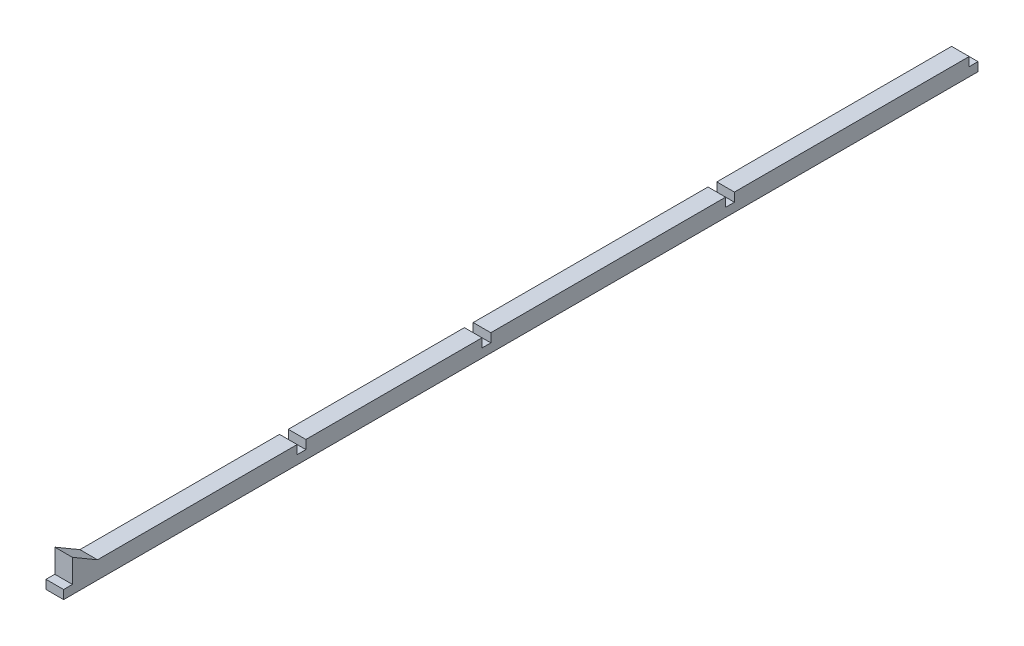
ISO-10303-21;
HEADER;
FILE_DESCRIPTION(('STEP AP214'),'2;1');
FILE_NAME('part.step','',(''),(''),'','','');
FILE_SCHEMA(('AUTOMOTIVE_DESIGN { 1 0 10303 214 1 1 1 1 }'));
ENDSEC;
DATA;
#1=APPLICATION_CONTEXT('core data for automotive mechanical design processes');
#2=APPLICATION_PROTOCOL_DEFINITION('international standard','automotive_design',2000,#1);
#3=PRODUCT_CONTEXT('',#1,'mechanical');
#4=PRODUCT('Part','Part','',(#3));
#5=PRODUCT_RELATED_PRODUCT_CATEGORY('part','',(#4));
#6=PRODUCT_DEFINITION_FORMATION('','',#4);
#7=PRODUCT_DEFINITION_CONTEXT('part definition',#1,'design');
#8=PRODUCT_DEFINITION('design','',#6,#7);
#9=PRODUCT_DEFINITION_SHAPE('','',#8);
#10=(LENGTH_UNIT() NAMED_UNIT(*) SI_UNIT(.MILLI.,.METRE.));
#11=(NAMED_UNIT(*) PLANE_ANGLE_UNIT() SI_UNIT($,.RADIAN.));
#12=(NAMED_UNIT(*) SI_UNIT($,.STERADIAN.) SOLID_ANGLE_UNIT());
#13=UNCERTAINTY_MEASURE_WITH_UNIT(LENGTH_MEASURE(1.E-05),#10,'distance_accuracy_value','');
#14=(GEOMETRIC_REPRESENTATION_CONTEXT(3) GLOBAL_UNCERTAINTY_ASSIGNED_CONTEXT((#13)) GLOBAL_UNIT_ASSIGNED_CONTEXT((#10,
#11,#12)) REPRESENTATION_CONTEXT('',''));
#15=CARTESIAN_POINT('',(0.,0.,0.));
#16=DIRECTION('',(0.,0.,1.));
#17=DIRECTION('',(1.,0.,0.));
#18=AXIS2_PLACEMENT_3D('',#15,#16,#17);
#19=CARTESIAN_POINT('',(6.,0.,411.808386432848));
#20=DIRECTION('',(0.,0.,-1.));
#21=DIRECTION('',(-1.,0.,0.));
#22=AXIS2_PLACEMENT_3D('',#19,#20,#21);
#23=PLANE('',#22);
#24=DIRECTION('',(0.,-1.,0.));
#25=VECTOR('',#24,1.);
#26=CARTESIAN_POINT('',(0.,0.,411.808386432848));
#27=LINE('',#26,#25);
#28=CARTESIAN_POINT('',(0.,3.,411.808386432848));
#29=VERTEX_POINT('',#28);
#30=CARTESIAN_POINT('',(0.,0.,411.808386432848));
#31=VERTEX_POINT('',#30);
#32=EDGE_CURVE('E215',#29,#31,#27,.T.);
#33=ORIENTED_EDGE('',*,*,#32,.T.);
#34=DIRECTION('',(-1.,0.,0.));
#35=VECTOR('',#34,1.);
#36=CARTESIAN_POINT('',(6.,0.,411.808386432848));
#37=LINE('',#36,#35);
#38=CARTESIAN_POINT('',(6.,0.,411.808386432848));
#39=VERTEX_POINT('',#38);
#40=EDGE_CURVE('E11',#39,#31,#37,.T.);
#41=ORIENTED_EDGE('',*,*,#40,.F.);
#42=DIRECTION('',(0.,-1.,0.));
#43=VECTOR('',#42,1.);
#44=CARTESIAN_POINT('',(6.,0.,411.808386432848));
#45=LINE('',#44,#43);
#46=CARTESIAN_POINT('',(6.,3.,411.808386432848));
#47=VERTEX_POINT('',#46);
#48=EDGE_CURVE('E255',#47,#39,#45,.T.);
#49=ORIENTED_EDGE('',*,*,#48,.F.);
#50=DIRECTION('',(-1.,0.,0.));
#51=VECTOR('',#50,1.);
#52=CARTESIAN_POINT('',(6.,3.,411.808386432848));
#53=LINE('',#52,#51);
#54=EDGE_CURVE('E211',#47,#29,#53,.T.);
#55=ORIENTED_EDGE('',*,*,#54,.T.);
#56=EDGE_LOOP('',(#33,#41,#49,#55));
#57=FACE_BOUND('',#56,.T.);
#58=ADVANCED_FACE('F41',(#57),#23,.F.);
#59=CARTESIAN_POINT('',(6.,0.,411.808386432848));
#60=DIRECTION('',(0.,1.,0.));
#61=DIRECTION('',(0.,0.,1.));
#62=AXIS2_PLACEMENT_3D('',#59,#60,#61);
#63=PLANE('',#62);
#64=DIRECTION('',(0.,0.,-1.));
#65=VECTOR('',#64,1.);
#66=CARTESIAN_POINT('',(0.,0.,411.808386432848));
#67=LINE('',#66,#65);
#68=CARTESIAN_POINT('',(0.,0.,100.248386432848));
#69=VERTEX_POINT('',#68);
#70=EDGE_CURVE('E218',#31,#69,#67,.T.);
#71=ORIENTED_EDGE('',*,*,#70,.T.);
#72=DIRECTION('',(-1.,0.,0.));
#73=VECTOR('',#72,1.);
#74=CARTESIAN_POINT('',(6.,0.,100.248386432848));
#75=LINE('',#74,#73);
#76=CARTESIAN_POINT('',(6.,0.,100.248386432848));
#77=VERTEX_POINT('',#76);
#78=EDGE_CURVE('E49',#77,#69,#75,.T.);
#79=ORIENTED_EDGE('',*,*,#78,.F.);
#80=DIRECTION('',(0.,0.,-1.));
#81=VECTOR('',#80,1.);
#82=CARTESIAN_POINT('',(6.,0.,411.808386432848));
#83=LINE('',#82,#81);
#84=EDGE_CURVE('E138',#39,#77,#83,.T.);
#85=ORIENTED_EDGE('',*,*,#84,.F.);
#86=ORIENTED_EDGE('',*,*,#40,.T.);
#87=EDGE_LOOP('',(#71,#79,#85,#86));
#88=FACE_BOUND('',#87,.T.);
#89=ADVANCED_FACE('F378',(#88),#63,.F.);
#90=CARTESIAN_POINT('',(6.,3.,100.248386432848));
#91=DIRECTION('',(0.,0.,1.));
#92=DIRECTION('',(1.,0.,0.));
#93=AXIS2_PLACEMENT_3D('',#90,#91,#92);
#94=PLANE('',#93);
#95=DIRECTION('',(0.,1.,0.));
#96=VECTOR('',#95,1.);
#97=CARTESIAN_POINT('',(0.,3.,100.248386432848));
#98=LINE('',#97,#96);
#99=CARTESIAN_POINT('',(0.,3.,100.248386432848));
#100=VERTEX_POINT('',#99);
#101=EDGE_CURVE('E220',#69,#100,#98,.T.);
#102=ORIENTED_EDGE('',*,*,#101,.T.);
#103=DIRECTION('',(-1.,0.,0.));
#104=VECTOR('',#103,1.);
#105=CARTESIAN_POINT('',(6.,3.,100.248386432848));
#106=LINE('',#105,#104);
#107=CARTESIAN_POINT('',(6.,3.,100.248386432848));
#108=VERTEX_POINT('',#107);
#109=EDGE_CURVE('E301',#108,#100,#106,.T.);
#110=ORIENTED_EDGE('',*,*,#109,.F.);
#111=DIRECTION('',(0.,1.,0.));
#112=VECTOR('',#111,1.);
#113=CARTESIAN_POINT('',(6.,3.,100.248386432848));
#114=LINE('',#113,#112);
#115=EDGE_CURVE('E309',#77,#108,#114,.T.);
#116=ORIENTED_EDGE('',*,*,#115,.F.);
#117=ORIENTED_EDGE('',*,*,#78,.T.);
#118=EDGE_LOOP('',(#102,#110,#116,#117));
#119=FACE_BOUND('',#118,.T.);
#120=ADVANCED_FACE('F307',(#119),#94,.F.);
#121=CARTESIAN_POINT('',(6.,3.,103.248386432848));
#122=DIRECTION('',(0.,-1.,0.));
#123=DIRECTION('',(0.,0.,-1.));
#124=AXIS2_PLACEMENT_3D('',#121,#122,#123);
#125=PLANE('',#124);
#126=DIRECTION('',(0.,0.,1.));
#127=VECTOR('',#126,1.);
#128=CARTESIAN_POINT('',(0.,3.,103.248386432848));
#129=LINE('',#128,#127);
#130=CARTESIAN_POINT('',(0.,3.,103.248386432848));
#131=VERTEX_POINT('',#130);
#132=EDGE_CURVE('E222',#100,#131,#129,.T.);
#133=ORIENTED_EDGE('',*,*,#132,.T.);
#134=DIRECTION('',(-1.,0.,0.));
#135=VECTOR('',#134,1.);
#136=CARTESIAN_POINT('',(6.,3.,103.248386432848));
#137=LINE('',#136,#135);
#138=CARTESIAN_POINT('',(6.,3.,103.248386432848));
#139=VERTEX_POINT('',#138);
#140=EDGE_CURVE('E298',#139,#131,#137,.T.);
#141=ORIENTED_EDGE('',*,*,#140,.F.);
#142=DIRECTION('',(0.,0.,1.));
#143=VECTOR('',#142,1.);
#144=CARTESIAN_POINT('',(6.,3.,103.248386432848));
#145=LINE('',#144,#143);
#146=EDGE_CURVE('E327',#108,#139,#145,.T.);
#147=ORIENTED_EDGE('',*,*,#146,.F.);
#148=ORIENTED_EDGE('',*,*,#109,.T.);
#149=EDGE_LOOP('',(#133,#141,#147,#148));
#150=FACE_BOUND('',#149,.T.);
#151=ADVANCED_FACE('F318',(#150),#125,.F.);
#152=CARTESIAN_POINT('',(6.,6.,103.248386432848));
#153=DIRECTION('',(0.,0.,1.));
#154=DIRECTION('',(1.,0.,0.));
#155=AXIS2_PLACEMENT_3D('',#152,#153,#154);
#156=PLANE('',#155);
#157=DIRECTION('',(0.,1.,0.));
#158=VECTOR('',#157,1.);
#159=CARTESIAN_POINT('',(0.,6.,103.248386432848));
#160=LINE('',#159,#158);
#161=CARTESIAN_POINT('',(0.,6.,103.248386432848));
#162=VERTEX_POINT('',#161);
#163=EDGE_CURVE('E224',#131,#162,#160,.T.);
#164=ORIENTED_EDGE('',*,*,#163,.T.);
#165=DIRECTION('',(-1.,0.,0.));
#166=VECTOR('',#165,1.);
#167=CARTESIAN_POINT('',(6.,6.,103.248386432848));
#168=LINE('',#167,#166);
#169=CARTESIAN_POINT('',(6.,6.,103.248386432848));
#170=VERTEX_POINT('',#169);
#171=EDGE_CURVE('E295',#170,#162,#168,.T.);
#172=ORIENTED_EDGE('',*,*,#171,.F.);
#173=DIRECTION('',(0.,1.,0.));
#174=VECTOR('',#173,1.);
#175=CARTESIAN_POINT('',(6.,6.,103.248386432848));
#176=LINE('',#175,#174);
#177=EDGE_CURVE('E324',#139,#170,#176,.T.);
#178=ORIENTED_EDGE('',*,*,#177,.F.);
#179=ORIENTED_EDGE('',*,*,#140,.T.);
#180=EDGE_LOOP('',(#164,#172,#178,#179));
#181=FACE_BOUND('',#180,.T.);
#182=ADVANCED_FACE('F322',(#181),#156,.F.);
#183=CARTESIAN_POINT('',(6.,6.,183.248386432848));
#184=DIRECTION('',(0.,-1.,0.));
#185=DIRECTION('',(0.,0.,-1.));
#186=AXIS2_PLACEMENT_3D('',#183,#184,#185);
#187=PLANE('',#186);
#188=DIRECTION('',(0.,0.,1.));
#189=VECTOR('',#188,1.);
#190=CARTESIAN_POINT('',(0.,6.,183.248386432848));
#191=LINE('',#190,#189);
#192=CARTESIAN_POINT('',(0.,6.,183.248386432848));
#193=VERTEX_POINT('',#192);
#194=EDGE_CURVE('E226',#162,#193,#191,.T.);
#195=ORIENTED_EDGE('',*,*,#194,.T.);
#196=DIRECTION('',(-1.,0.,0.));
#197=VECTOR('',#196,1.);
#198=CARTESIAN_POINT('',(6.,6.,183.248386432848));
#199=LINE('',#198,#197);
#200=CARTESIAN_POINT('',(6.,6.,183.248386432848));
#201=VERTEX_POINT('',#200);
#202=EDGE_CURVE('E292',#201,#193,#199,.T.);
#203=ORIENTED_EDGE('',*,*,#202,.F.);
#204=DIRECTION('',(0.,0.,1.));
#205=VECTOR('',#204,1.);
#206=CARTESIAN_POINT('',(6.,6.,183.248386432848));
#207=LINE('',#206,#205);
#208=EDGE_CURVE('E326',#170,#201,#207,.T.);
#209=ORIENTED_EDGE('',*,*,#208,.F.);
#210=ORIENTED_EDGE('',*,*,#171,.T.);
#211=EDGE_LOOP('',(#195,#203,#209,#210));
#212=FACE_BOUND('',#211,.T.);
#213=ADVANCED_FACE('F391',(#212),#187,.F.);
#214=CARTESIAN_POINT('',(6.,3.,183.248386432848));
#215=DIRECTION('',(0.,0.,-1.));
#216=DIRECTION('',(-1.,0.,0.));
#217=AXIS2_PLACEMENT_3D('',#214,#215,#216);
#218=PLANE('',#217);
#219=DIRECTION('',(0.,-1.,0.));
#220=VECTOR('',#219,1.);
#221=CARTESIAN_POINT('',(0.,3.,183.248386432848));
#222=LINE('',#221,#220);
#223=CARTESIAN_POINT('',(0.,3.,183.248386432848));
#224=VERTEX_POINT('',#223);
#225=EDGE_CURVE('E228',#193,#224,#222,.T.);
#226=ORIENTED_EDGE('',*,*,#225,.T.);
#227=DIRECTION('',(-1.,0.,0.));
#228=VECTOR('',#227,1.);
#229=CARTESIAN_POINT('',(6.,3.,183.248386432848));
#230=LINE('',#229,#228);
#231=CARTESIAN_POINT('',(6.,3.,183.248386432848));
#232=VERTEX_POINT('',#231);
#233=EDGE_CURVE('E289',#232,#224,#230,.T.);
#234=ORIENTED_EDGE('',*,*,#233,.F.);
#235=DIRECTION('',(0.,-1.,0.));
#236=VECTOR('',#235,1.);
#237=CARTESIAN_POINT('',(6.,3.,183.248386432848));
#238=LINE('',#237,#236);
#239=EDGE_CURVE('E329',#201,#232,#238,.T.);
#240=ORIENTED_EDGE('',*,*,#239,.F.);
#241=ORIENTED_EDGE('',*,*,#202,.T.);
#242=EDGE_LOOP('',(#226,#234,#240,#241));
#243=FACE_BOUND('',#242,.T.);
#244=ADVANCED_FACE('F394',(#243),#218,.F.);
#245=CARTESIAN_POINT('',(6.,3.,186.248386432848));
#246=DIRECTION('',(0.,-1.,0.));
#247=DIRECTION('',(0.,0.,-1.));
#248=AXIS2_PLACEMENT_3D('',#245,#246,#247);
#249=PLANE('',#248);
#250=DIRECTION('',(0.,0.,1.));
#251=VECTOR('',#250,1.);
#252=CARTESIAN_POINT('',(0.,3.,186.248386432848));
#253=LINE('',#252,#251);
#254=CARTESIAN_POINT('',(0.,3.,186.248386432848));
#255=VERTEX_POINT('',#254);
#256=EDGE_CURVE('E230',#224,#255,#253,.T.);
#257=ORIENTED_EDGE('',*,*,#256,.T.);
#258=DIRECTION('',(-1.,0.,0.));
#259=VECTOR('',#258,1.);
#260=CARTESIAN_POINT('',(6.,3.,186.248386432848));
#261=LINE('',#260,#259);
#262=CARTESIAN_POINT('',(6.,3.,186.248386432848));
#263=VERTEX_POINT('',#262);
#264=EDGE_CURVE('E286',#263,#255,#261,.T.);
#265=ORIENTED_EDGE('',*,*,#264,.F.);
#266=DIRECTION('',(0.,0.,1.));
#267=VECTOR('',#266,1.);
#268=CARTESIAN_POINT('',(6.,3.,186.248386432848));
#269=LINE('',#268,#267);
#270=EDGE_CURVE('E335',#232,#263,#269,.T.);
#271=ORIENTED_EDGE('',*,*,#270,.F.);
#272=ORIENTED_EDGE('',*,*,#233,.T.);
#273=EDGE_LOOP('',(#257,#265,#271,#272));
#274=FACE_BOUND('',#273,.T.);
#275=ADVANCED_FACE('F398',(#274),#249,.F.);
#276=CARTESIAN_POINT('',(6.,6.,186.248386432848));
#277=DIRECTION('',(0.,0.,1.));
#278=DIRECTION('',(1.,0.,0.));
#279=AXIS2_PLACEMENT_3D('',#276,#277,#278);
#280=PLANE('',#279);
#281=DIRECTION('',(0.,1.,0.));
#282=VECTOR('',#281,1.);
#283=CARTESIAN_POINT('',(0.,6.,186.248386432848));
#284=LINE('',#283,#282);
#285=CARTESIAN_POINT('',(0.,6.,186.248386432848));
#286=VERTEX_POINT('',#285);
#287=EDGE_CURVE('E232',#255,#286,#284,.T.);
#288=ORIENTED_EDGE('',*,*,#287,.T.);
#289=DIRECTION('',(-1.,0.,0.));
#290=VECTOR('',#289,1.);
#291=CARTESIAN_POINT('',(6.,6.,186.248386432848));
#292=LINE('',#291,#290);
#293=CARTESIAN_POINT('',(6.,6.,186.248386432848));
#294=VERTEX_POINT('',#293);
#295=EDGE_CURVE('E283',#294,#286,#292,.T.);
#296=ORIENTED_EDGE('',*,*,#295,.F.);
#297=DIRECTION('',(0.,1.,0.));
#298=VECTOR('',#297,1.);
#299=CARTESIAN_POINT('',(6.,6.,186.248386432848));
#300=LINE('',#299,#298);
#301=EDGE_CURVE('E337',#263,#294,#300,.T.);
#302=ORIENTED_EDGE('',*,*,#301,.F.);
#303=ORIENTED_EDGE('',*,*,#264,.T.);
#304=EDGE_LOOP('',(#288,#296,#302,#303));
#305=FACE_BOUND('',#304,.T.);
#306=ADVANCED_FACE('F402',(#305),#280,.F.);
#307=CARTESIAN_POINT('',(6.,6.,266.248386432848));
#308=DIRECTION('',(0.,-1.,0.));
#309=DIRECTION('',(0.,0.,-1.));
#310=AXIS2_PLACEMENT_3D('',#307,#308,#309);
#311=PLANE('',#310);
#312=DIRECTION('',(0.,0.,1.));
#313=VECTOR('',#312,1.);
#314=CARTESIAN_POINT('',(0.,6.,266.248386432848));
#315=LINE('',#314,#313);
#316=CARTESIAN_POINT('',(0.,6.,266.248386432848));
#317=VERTEX_POINT('',#316);
#318=EDGE_CURVE('E234',#286,#317,#315,.T.);
#319=ORIENTED_EDGE('',*,*,#318,.T.);
#320=DIRECTION('',(-1.,0.,0.));
#321=VECTOR('',#320,1.);
#322=CARTESIAN_POINT('',(6.,6.,266.248386432848));
#323=LINE('',#322,#321);
#324=CARTESIAN_POINT('',(6.,6.,266.248386432848));
#325=VERTEX_POINT('',#324);
#326=EDGE_CURVE('E280',#325,#317,#323,.T.);
#327=ORIENTED_EDGE('',*,*,#326,.F.);
#328=DIRECTION('',(0.,0.,1.));
#329=VECTOR('',#328,1.);
#330=CARTESIAN_POINT('',(6.,6.,266.248386432848));
#331=LINE('',#330,#329);
#332=EDGE_CURVE('E339',#294,#325,#331,.T.);
#333=ORIENTED_EDGE('',*,*,#332,.F.);
#334=ORIENTED_EDGE('',*,*,#295,.T.);
#335=EDGE_LOOP('',(#319,#327,#333,#334));
#336=FACE_BOUND('',#335,.T.);
#337=ADVANCED_FACE('F406',(#336),#311,.F.);
#338=CARTESIAN_POINT('',(6.,3.,266.248386432848));
#339=DIRECTION('',(0.,0.,-1.));
#340=DIRECTION('',(-1.,0.,0.));
#341=AXIS2_PLACEMENT_3D('',#338,#339,#340);
#342=PLANE('',#341);
#343=DIRECTION('',(0.,-1.,0.));
#344=VECTOR('',#343,1.);
#345=CARTESIAN_POINT('',(0.,3.,266.248386432848));
#346=LINE('',#345,#344);
#347=CARTESIAN_POINT('',(0.,3.,266.248386432848));
#348=VERTEX_POINT('',#347);
#349=EDGE_CURVE('E236',#317,#348,#346,.T.);
#350=ORIENTED_EDGE('',*,*,#349,.T.);
#351=DIRECTION('',(-1.,0.,0.));
#352=VECTOR('',#351,1.);
#353=CARTESIAN_POINT('',(6.,3.,266.248386432848));
#354=LINE('',#353,#352);
#355=CARTESIAN_POINT('',(6.,3.,266.248386432848));
#356=VERTEX_POINT('',#355);
#357=EDGE_CURVE('E277',#356,#348,#354,.T.);
#358=ORIENTED_EDGE('',*,*,#357,.F.);
#359=DIRECTION('',(0.,-1.,0.));
#360=VECTOR('',#359,1.);
#361=CARTESIAN_POINT('',(6.,3.,266.248386432848));
#362=LINE('',#361,#360);
#363=EDGE_CURVE('E341',#325,#356,#362,.T.);
#364=ORIENTED_EDGE('',*,*,#363,.F.);
#365=ORIENTED_EDGE('',*,*,#326,.T.);
#366=EDGE_LOOP('',(#350,#358,#364,#365));
#367=FACE_BOUND('',#366,.T.);
#368=ADVANCED_FACE('F410',(#367),#342,.F.);
#369=CARTESIAN_POINT('',(6.,3.,269.248386432848));
#370=DIRECTION('',(0.,-1.,0.));
#371=DIRECTION('',(0.,0.,-1.));
#372=AXIS2_PLACEMENT_3D('',#369,#370,#371);
#373=PLANE('',#372);
#374=DIRECTION('',(0.,0.,1.));
#375=VECTOR('',#374,1.);
#376=CARTESIAN_POINT('',(0.,3.,269.248386432848));
#377=LINE('',#376,#375);
#378=CARTESIAN_POINT('',(0.,3.,269.248386432848));
#379=VERTEX_POINT('',#378);
#380=EDGE_CURVE('E238',#348,#379,#377,.T.);
#381=ORIENTED_EDGE('',*,*,#380,.T.);
#382=DIRECTION('',(-1.,0.,0.));
#383=VECTOR('',#382,1.);
#384=CARTESIAN_POINT('',(6.,3.,269.248386432848));
#385=LINE('',#384,#383);
#386=CARTESIAN_POINT('',(6.,3.,269.248386432848));
#387=VERTEX_POINT('',#386);
#388=EDGE_CURVE('E274',#387,#379,#385,.T.);
#389=ORIENTED_EDGE('',*,*,#388,.F.);
#390=DIRECTION('',(0.,0.,1.));
#391=VECTOR('',#390,1.);
#392=CARTESIAN_POINT('',(6.,3.,269.248386432848));
#393=LINE('',#392,#391);
#394=EDGE_CURVE('E343',#356,#387,#393,.T.);
#395=ORIENTED_EDGE('',*,*,#394,.F.);
#396=ORIENTED_EDGE('',*,*,#357,.T.);
#397=EDGE_LOOP('',(#381,#389,#395,#396));
#398=FACE_BOUND('',#397,.T.);
#399=ADVANCED_FACE('F414',(#398),#373,.F.);
#400=CARTESIAN_POINT('',(6.,6.,269.248386432848));
#401=DIRECTION('',(0.,0.,1.));
#402=DIRECTION('',(1.,0.,0.));
#403=AXIS2_PLACEMENT_3D('',#400,#401,#402);
#404=PLANE('',#403);
#405=DIRECTION('',(0.,1.,0.));
#406=VECTOR('',#405,1.);
#407=CARTESIAN_POINT('',(0.,6.,269.248386432848));
#408=LINE('',#407,#406);
#409=CARTESIAN_POINT('',(0.,6.,269.248386432848));
#410=VERTEX_POINT('',#409);
#411=EDGE_CURVE('E240',#379,#410,#408,.T.);
#412=ORIENTED_EDGE('',*,*,#411,.T.);
#413=DIRECTION('',(-1.,0.,0.));
#414=VECTOR('',#413,1.);
#415=CARTESIAN_POINT('',(6.,6.,269.248386432848));
#416=LINE('',#415,#414);
#417=CARTESIAN_POINT('',(6.,6.,269.248386432848));
#418=VERTEX_POINT('',#417);
#419=EDGE_CURVE('E271',#418,#410,#416,.T.);
#420=ORIENTED_EDGE('',*,*,#419,.F.);
#421=DIRECTION('',(0.,1.,0.));
#422=VECTOR('',#421,1.);
#423=CARTESIAN_POINT('',(6.,6.,269.248386432848));
#424=LINE('',#423,#422);
#425=EDGE_CURVE('E345',#387,#418,#424,.T.);
#426=ORIENTED_EDGE('',*,*,#425,.F.);
#427=ORIENTED_EDGE('',*,*,#388,.T.);
#428=EDGE_LOOP('',(#412,#420,#426,#427));
#429=FACE_BOUND('',#428,.T.);
#430=ADVANCED_FACE('F418',(#429),#404,.F.);
#431=CARTESIAN_POINT('',(6.,6.,329.248386432848));
#432=DIRECTION('',(0.,-1.,0.));
#433=DIRECTION('',(0.,0.,-1.));
#434=AXIS2_PLACEMENT_3D('',#431,#432,#433);
#435=PLANE('',#434);
#436=DIRECTION('',(0.,0.,1.));
#437=VECTOR('',#436,1.);
#438=CARTESIAN_POINT('',(0.,6.,329.248386432848));
#439=LINE('',#438,#437);
#440=CARTESIAN_POINT('',(0.,6.,329.248386432848));
#441=VERTEX_POINT('',#440);
#442=EDGE_CURVE('E242',#410,#441,#439,.T.);
#443=ORIENTED_EDGE('',*,*,#442,.T.);
#444=DIRECTION('',(-1.,0.,0.));
#445=VECTOR('',#444,1.);
#446=CARTESIAN_POINT('',(6.,6.,329.248386432848));
#447=LINE('',#446,#445);
#448=CARTESIAN_POINT('',(6.,6.,329.248386432848));
#449=VERTEX_POINT('',#448);
#450=EDGE_CURVE('E268',#449,#441,#447,.T.);
#451=ORIENTED_EDGE('',*,*,#450,.F.);
#452=DIRECTION('',(0.,0.,1.));
#453=VECTOR('',#452,1.);
#454=CARTESIAN_POINT('',(6.,6.,329.248386432848));
#455=LINE('',#454,#453);
#456=EDGE_CURVE('E347',#418,#449,#455,.T.);
#457=ORIENTED_EDGE('',*,*,#456,.F.);
#458=ORIENTED_EDGE('',*,*,#419,.T.);
#459=EDGE_LOOP('',(#443,#451,#457,#458));
#460=FACE_BOUND('',#459,.T.);
#461=ADVANCED_FACE('F422',(#460),#435,.F.);
#462=CARTESIAN_POINT('',(6.,3.,329.248386432848));
#463=DIRECTION('',(0.,0.,-1.));
#464=DIRECTION('',(-1.,0.,0.));
#465=AXIS2_PLACEMENT_3D('',#462,#463,#464);
#466=PLANE('',#465);
#467=DIRECTION('',(0.,-1.,0.));
#468=VECTOR('',#467,1.);
#469=CARTESIAN_POINT('',(0.,3.,329.248386432848));
#470=LINE('',#469,#468);
#471=CARTESIAN_POINT('',(0.,3.,329.248386432848));
#472=VERTEX_POINT('',#471);
#473=EDGE_CURVE('E244',#441,#472,#470,.T.);
#474=ORIENTED_EDGE('',*,*,#473,.T.);
#475=DIRECTION('',(-1.,0.,0.));
#476=VECTOR('',#475,1.);
#477=CARTESIAN_POINT('',(6.,3.,329.248386432848));
#478=LINE('',#477,#476);
#479=CARTESIAN_POINT('',(6.,3.,329.248386432848));
#480=VERTEX_POINT('',#479);
#481=EDGE_CURVE('E265',#480,#472,#478,.T.);
#482=ORIENTED_EDGE('',*,*,#481,.F.);
#483=DIRECTION('',(0.,-1.,0.));
#484=VECTOR('',#483,1.);
#485=CARTESIAN_POINT('',(6.,3.,329.248386432848));
#486=LINE('',#485,#484);
#487=EDGE_CURVE('E349',#449,#480,#486,.T.);
#488=ORIENTED_EDGE('',*,*,#487,.F.);
#489=ORIENTED_EDGE('',*,*,#450,.T.);
#490=EDGE_LOOP('',(#474,#482,#488,#489));
#491=FACE_BOUND('',#490,.T.);
#492=ADVANCED_FACE('F426',(#491),#466,.F.);
#493=CARTESIAN_POINT('',(6.,3.,332.248386432848));
#494=DIRECTION('',(0.,-1.,0.));
#495=DIRECTION('',(0.,0.,-1.));
#496=AXIS2_PLACEMENT_3D('',#493,#494,#495);
#497=PLANE('',#496);
#498=DIRECTION('',(0.,0.,1.));
#499=VECTOR('',#498,1.);
#500=CARTESIAN_POINT('',(0.,3.,332.248386432848));
#501=LINE('',#500,#499);
#502=CARTESIAN_POINT('',(0.,3.,332.248386432848));
#503=VERTEX_POINT('',#502);
#504=EDGE_CURVE('E246',#472,#503,#501,.T.);
#505=ORIENTED_EDGE('',*,*,#504,.T.);
#506=DIRECTION('',(-1.,0.,0.));
#507=VECTOR('',#506,1.);
#508=CARTESIAN_POINT('',(6.,3.,332.248386432848));
#509=LINE('',#508,#507);
#510=CARTESIAN_POINT('',(6.,3.,332.248386432848));
#511=VERTEX_POINT('',#510);
#512=EDGE_CURVE('E262',#511,#503,#509,.T.);
#513=ORIENTED_EDGE('',*,*,#512,.F.);
#514=DIRECTION('',(0.,0.,1.));
#515=VECTOR('',#514,1.);
#516=CARTESIAN_POINT('',(6.,3.,332.248386432848));
#517=LINE('',#516,#515);
#518=EDGE_CURVE('E351',#480,#511,#517,.T.);
#519=ORIENTED_EDGE('',*,*,#518,.F.);
#520=ORIENTED_EDGE('',*,*,#481,.T.);
#521=EDGE_LOOP('',(#505,#513,#519,#520));
#522=FACE_BOUND('',#521,.T.);
#523=ADVANCED_FACE('F430',(#522),#497,.F.);
#524=CARTESIAN_POINT('',(6.,6.,332.248386432848));
#525=DIRECTION('',(0.,0.,1.));
#526=DIRECTION('',(1.,0.,0.));
#527=AXIS2_PLACEMENT_3D('',#524,#525,#526);
#528=PLANE('',#527);
#529=DIRECTION('',(0.,1.,0.));
#530=VECTOR('',#529,1.);
#531=CARTESIAN_POINT('',(0.,6.,332.248386432848));
#532=LINE('',#531,#530);
#533=CARTESIAN_POINT('',(0.,6.,332.248386432848));
#534=VERTEX_POINT('',#533);
#535=EDGE_CURVE('E248',#503,#534,#532,.T.);
#536=ORIENTED_EDGE('',*,*,#535,.T.);
#537=DIRECTION('',(-1.,0.,0.));
#538=VECTOR('',#537,1.);
#539=CARTESIAN_POINT('',(6.,6.,332.248386432848));
#540=LINE('',#539,#538);
#541=CARTESIAN_POINT('',(6.,6.,332.248386432848));
#542=VERTEX_POINT('',#541);
#543=EDGE_CURVE('E259',#542,#534,#540,.T.);
#544=ORIENTED_EDGE('',*,*,#543,.F.);
#545=DIRECTION('',(0.,1.,0.));
#546=VECTOR('',#545,1.);
#547=CARTESIAN_POINT('',(6.,6.,332.248386432848));
#548=LINE('',#547,#546);
#549=EDGE_CURVE('E353',#511,#542,#548,.T.);
#550=ORIENTED_EDGE('',*,*,#549,.F.);
#551=ORIENTED_EDGE('',*,*,#512,.T.);
#552=EDGE_LOOP('',(#536,#544,#550,#551));
#553=FACE_BOUND('',#552,.T.);
#554=ADVANCED_FACE('F359',(#553),#528,.F.);
#555=CARTESIAN_POINT('',(6.,6.,400.259443478628));
#556=DIRECTION('',(0.,-1.,0.));
#557=DIRECTION('',(0.,0.,-1.));
#558=AXIS2_PLACEMENT_3D('',#555,#556,#557);
#559=PLANE('',#558);
#560=DIRECTION('',(0.,0.,1.));
#561=VECTOR('',#560,1.);
#562=CARTESIAN_POINT('',(0.,6.,400.259443478628));
#563=LINE('',#562,#561);
#564=CARTESIAN_POINT('',(0.,6.,400.259443478628));
#565=VERTEX_POINT('',#564);
#566=EDGE_CURVE('E250',#534,#565,#563,.T.);
#567=ORIENTED_EDGE('',*,*,#566,.T.);
#568=DIRECTION('',(-1.,0.,0.));
#569=VECTOR('',#568,1.);
#570=CARTESIAN_POINT('',(6.,6.,400.259443478628));
#571=LINE('',#570,#569);
#572=CARTESIAN_POINT('',(6.,6.,400.259443478628));
#573=VERTEX_POINT('',#572);
#574=EDGE_CURVE('E206',#573,#565,#571,.T.);
#575=ORIENTED_EDGE('',*,*,#574,.F.);
#576=DIRECTION('',(0.,0.,1.));
#577=VECTOR('',#576,1.);
#578=CARTESIAN_POINT('',(6.,6.,400.259443478628));
#579=LINE('',#578,#577);
#580=EDGE_CURVE('E196',#542,#573,#579,.T.);
#581=ORIENTED_EDGE('',*,*,#580,.F.);
#582=ORIENTED_EDGE('',*,*,#543,.T.);
#583=EDGE_LOOP('',(#567,#575,#581,#582));
#584=FACE_BOUND('',#583,.T.);
#585=ADVANCED_FACE('F363',(#584),#559,.F.);
#586=CARTESIAN_POINT('',(6.,11.,408.808386432848));
#587=DIRECTION('',(0.,-0.863201909679451,0.504858854657169));
#588=DIRECTION('',(0.,-0.504858854657169,-0.863201909679451));
#589=AXIS2_PLACEMENT_3D('',#586,#587,#588);
#590=PLANE('',#589);
#591=DIRECTION('',(0.,0.504858854657169,0.863201909679451));
#592=VECTOR('',#591,1.);
#593=CARTESIAN_POINT('',(0.,11.,408.808386432848));
#594=LINE('',#593,#592);
#595=CARTESIAN_POINT('',(0.,11.,408.808386432848));
#596=VERTEX_POINT('',#595);
#597=EDGE_CURVE('E205',#565,#596,#594,.T.);
#598=ORIENTED_EDGE('',*,*,#597,.T.);
#599=DIRECTION('',(-1.,0.,0.));
#600=VECTOR('',#599,1.);
#601=CARTESIAN_POINT('',(6.,11.,408.808386432848));
#602=LINE('',#601,#600);
#603=CARTESIAN_POINT('',(6.,11.,408.808386432848));
#604=VERTEX_POINT('',#603);
#605=EDGE_CURVE('E202',#604,#596,#602,.T.);
#606=ORIENTED_EDGE('',*,*,#605,.F.);
#607=DIRECTION('',(0.,0.504858854657169,0.863201909679451));
#608=VECTOR('',#607,1.);
#609=CARTESIAN_POINT('',(6.,11.,408.808386432848));
#610=LINE('',#609,#608);
#611=EDGE_CURVE('E190',#573,#604,#610,.T.);
#612=ORIENTED_EDGE('',*,*,#611,.F.);
#613=ORIENTED_EDGE('',*,*,#574,.T.);
#614=EDGE_LOOP('',(#598,#606,#612,#613));
#615=FACE_BOUND('',#614,.T.);
#616=ADVANCED_FACE('F203',(#615),#590,.F.);
#617=CARTESIAN_POINT('',(6.,3.,408.808386432848));
#618=DIRECTION('',(0.,0.,-1.));
#619=DIRECTION('',(-1.,0.,0.));
#620=AXIS2_PLACEMENT_3D('',#617,#618,#619);
#621=PLANE('',#620);
#622=DIRECTION('',(0.,-1.,0.));
#623=VECTOR('',#622,1.);
#624=CARTESIAN_POINT('',(0.,3.,408.808386432848));
#625=LINE('',#624,#623);
#626=CARTESIAN_POINT('',(0.,3.,408.808386432848));
#627=VERTEX_POINT('',#626);
#628=EDGE_CURVE('E124',#596,#627,#625,.T.);
#629=ORIENTED_EDGE('',*,*,#628,.T.);
#630=DIRECTION('',(-1.,0.,0.));
#631=VECTOR('',#630,1.);
#632=CARTESIAN_POINT('',(6.,3.,408.808386432848));
#633=LINE('',#632,#631);
#634=CARTESIAN_POINT('',(6.,3.,408.808386432848));
#635=VERTEX_POINT('',#634);
#636=EDGE_CURVE('E207',#635,#627,#633,.T.);
#637=ORIENTED_EDGE('',*,*,#636,.F.);
#638=DIRECTION('',(0.,-1.,0.));
#639=VECTOR('',#638,1.);
#640=CARTESIAN_POINT('',(6.,11.,408.808386432848));
#641=LINE('',#640,#639);
#642=EDGE_CURVE('E194',#604,#635,#641,.T.);
#643=ORIENTED_EDGE('',*,*,#642,.F.);
#644=ORIENTED_EDGE('',*,*,#605,.T.);
#645=EDGE_LOOP('',(#629,#637,#643,#644));
#646=FACE_BOUND('',#645,.T.);
#647=ADVANCED_FACE('F209',(#646),#621,.F.);
#648=CARTESIAN_POINT('',(6.,3.,411.808386432848));
#649=DIRECTION('',(0.,-1.,0.));
#650=DIRECTION('',(0.,0.,-1.));
#651=AXIS2_PLACEMENT_3D('',#648,#649,#650);
#652=PLANE('',#651);
#653=DIRECTION('',(0.,0.,1.));
#654=VECTOR('',#653,1.);
#655=CARTESIAN_POINT('',(0.,3.,411.808386432848));
#656=LINE('',#655,#654);
#657=EDGE_CURVE('E130',#627,#29,#656,.T.);
#658=ORIENTED_EDGE('',*,*,#657,.T.);
#659=ORIENTED_EDGE('',*,*,#54,.F.);
#660=DIRECTION('',(0.,0.,1.));
#661=VECTOR('',#660,1.);
#662=CARTESIAN_POINT('',(6.,3.,411.808386432848));
#663=LINE('',#662,#661);
#664=EDGE_CURVE('E57',#635,#47,#663,.T.);
#665=ORIENTED_EDGE('',*,*,#664,.F.);
#666=ORIENTED_EDGE('',*,*,#636,.T.);
#667=EDGE_LOOP('',(#658,#659,#665,#666));
#668=FACE_BOUND('',#667,.T.);
#669=ADVANCED_FACE('F367',(#668),#652,.F.);
#670=CARTESIAN_POINT('',(6.,0.,0.));
#671=DIRECTION('',(-1.,0.,0.));
#672=DIRECTION('',(0.,0.,1.));
#673=AXIS2_PLACEMENT_3D('',#670,#671,#672);
#674=PLANE('',#673);
#675=ORIENTED_EDGE('',*,*,#48,.T.);
#676=ORIENTED_EDGE('',*,*,#84,.T.);
#677=ORIENTED_EDGE('',*,*,#115,.T.);
#678=ORIENTED_EDGE('',*,*,#146,.T.);
#679=ORIENTED_EDGE('',*,*,#177,.T.);
#680=ORIENTED_EDGE('',*,*,#208,.T.);
#681=ORIENTED_EDGE('',*,*,#239,.T.);
#682=ORIENTED_EDGE('',*,*,#270,.T.);
#683=ORIENTED_EDGE('',*,*,#301,.T.);
#684=ORIENTED_EDGE('',*,*,#332,.T.);
#685=ORIENTED_EDGE('',*,*,#363,.T.);
#686=ORIENTED_EDGE('',*,*,#394,.T.);
#687=ORIENTED_EDGE('',*,*,#425,.T.);
#688=ORIENTED_EDGE('',*,*,#456,.T.);
#689=ORIENTED_EDGE('',*,*,#487,.T.);
#690=ORIENTED_EDGE('',*,*,#518,.T.);
#691=ORIENTED_EDGE('',*,*,#549,.T.);
#692=ORIENTED_EDGE('',*,*,#580,.T.);
#693=ORIENTED_EDGE('',*,*,#611,.T.);
#694=ORIENTED_EDGE('',*,*,#642,.T.);
#695=ORIENTED_EDGE('',*,*,#664,.T.);
#696=EDGE_LOOP('',(#675,#676,#677,#678,#679,#680,#681,#682,#683,#684,#685,#686,#687,#688,#689,
#690,#691,#692,#693,#694,#695));
#697=FACE_BOUND('',#696,.T.);
#698=ADVANCED_FACE('F192',(#697),#674,.F.);
#699=CARTESIAN_POINT('',(0.,0.,0.));
#700=DIRECTION('',(-1.,0.,0.));
#701=DIRECTION('',(0.,0.,1.));
#702=AXIS2_PLACEMENT_3D('',#699,#700,#701);
#703=PLANE('',#702);
#704=ORIENTED_EDGE('',*,*,#32,.F.);
#705=ORIENTED_EDGE('',*,*,#657,.F.);
#706=ORIENTED_EDGE('',*,*,#628,.F.);
#707=ORIENTED_EDGE('',*,*,#597,.F.);
#708=ORIENTED_EDGE('',*,*,#566,.F.);
#709=ORIENTED_EDGE('',*,*,#535,.F.);
#710=ORIENTED_EDGE('',*,*,#504,.F.);
#711=ORIENTED_EDGE('',*,*,#473,.F.);
#712=ORIENTED_EDGE('',*,*,#442,.F.);
#713=ORIENTED_EDGE('',*,*,#411,.F.);
#714=ORIENTED_EDGE('',*,*,#380,.F.);
#715=ORIENTED_EDGE('',*,*,#349,.F.);
#716=ORIENTED_EDGE('',*,*,#318,.F.);
#717=ORIENTED_EDGE('',*,*,#287,.F.);
#718=ORIENTED_EDGE('',*,*,#256,.F.);
#719=ORIENTED_EDGE('',*,*,#225,.F.);
#720=ORIENTED_EDGE('',*,*,#194,.F.);
#721=ORIENTED_EDGE('',*,*,#163,.F.);
#722=ORIENTED_EDGE('',*,*,#132,.F.);
#723=ORIENTED_EDGE('',*,*,#101,.F.);
#724=ORIENTED_EDGE('',*,*,#70,.F.);
#725=EDGE_LOOP('',(#704,#705,#706,#707,#708,#709,#710,#711,#712,#713,#714,#715,#716,#717,#718,
#719,#720,#721,#722,#723,#724));
#726=FACE_BOUND('',#725,.T.);
#727=ADVANCED_FACE('F313',(#726),#703,.T.);
#728=CLOSED_SHELL('',(#58,#89,#120,#151,#182,#213,#244,#275,#306,#337,#368,#399,#430,#461,#492,
#523,#554,#585,#616,#647,#669,#698,#727));
#729=MANIFOLD_SOLID_BREP('B2',#728);
#730=ADVANCED_BREP_SHAPE_REPRESENTATION('',(#18,#729),#14);
#731=SHAPE_DEFINITION_REPRESENTATION(#9,#730);
ENDSEC;
END-ISO-10303-21;
